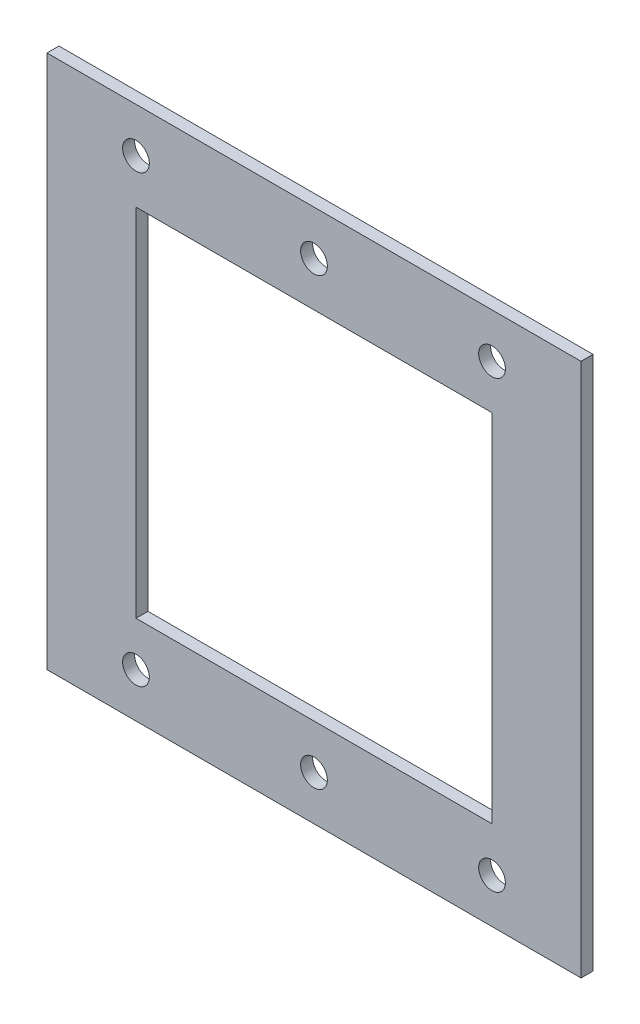
ISO-10303-21;
HEADER;
FILE_DESCRIPTION(('STEP AP214'),'2;1');
FILE_NAME('part.step','',(''),(''),'','','');
FILE_SCHEMA(('AUTOMOTIVE_DESIGN { 1 0 10303 214 1 1 1 1 }'));
ENDSEC;
DATA;
#1=APPLICATION_CONTEXT('core data for automotive mechanical design processes');
#2=APPLICATION_PROTOCOL_DEFINITION('international standard','automotive_design',2000,#1);
#3=PRODUCT_CONTEXT('',#1,'mechanical');
#4=PRODUCT('Part','Part','',(#3));
#5=PRODUCT_RELATED_PRODUCT_CATEGORY('part','',(#4));
#6=PRODUCT_DEFINITION_FORMATION('','',#4);
#7=PRODUCT_DEFINITION_CONTEXT('part definition',#1,'design');
#8=PRODUCT_DEFINITION('design','',#6,#7);
#9=PRODUCT_DEFINITION_SHAPE('','',#8);
#10=(LENGTH_UNIT() NAMED_UNIT(*) SI_UNIT(.MILLI.,.METRE.));
#11=(NAMED_UNIT(*) PLANE_ANGLE_UNIT() SI_UNIT($,.RADIAN.));
#12=(NAMED_UNIT(*) SI_UNIT($,.STERADIAN.) SOLID_ANGLE_UNIT());
#13=UNCERTAINTY_MEASURE_WITH_UNIT(LENGTH_MEASURE(1.E-05),#10,'distance_accuracy_value','');
#14=(GEOMETRIC_REPRESENTATION_CONTEXT(3) GLOBAL_UNCERTAINTY_ASSIGNED_CONTEXT((#13)) GLOBAL_UNIT_ASSIGNED_CONTEXT((#10,
#11,#12)) REPRESENTATION_CONTEXT('',''));
#15=CARTESIAN_POINT('',(0.,0.,0.));
#16=DIRECTION('',(0.,0.,1.));
#17=DIRECTION('',(1.,0.,0.));
#18=AXIS2_PLACEMENT_3D('',#15,#16,#17);
#19=CARTESIAN_POINT('',(0.,0.,2.7));
#20=DIRECTION('',(0.,0.,-1.));
#21=DIRECTION('',(-1.,0.,0.));
#22=AXIS2_PLACEMENT_3D('',#19,#20,#21);
#23=PLANE('',#22);
#24=CARTESIAN_POINT('',(40.,-50.,2.7));
#25=DIRECTION('',(0.,0.,1.));
#26=DIRECTION('',(1.,0.,0.));
#27=AXIS2_PLACEMENT_3D('',#24,#25,#26);
#28=CIRCLE('',#27,3.);
#29=CARTESIAN_POINT('',(37.,-50.,2.7));
#30=VERTEX_POINT('',#29);
#31=EDGE_CURVE('E144',#30,#30,#28,.T.);
#32=ORIENTED_EDGE('',*,*,#31,.F.);
#33=EDGE_LOOP('',(#32));
#34=FACE_BOUND('',#33,.T.);
#35=CARTESIAN_POINT('',(0.,-50.,2.7));
#36=DIRECTION('',(0.,0.,1.));
#37=DIRECTION('',(1.,0.,0.));
#38=AXIS2_PLACEMENT_3D('',#35,#36,#37);
#39=CIRCLE('',#38,3.00000000000001);
#40=CARTESIAN_POINT('',(-3.00000000000001,-50.,2.7));
#41=VERTEX_POINT('',#40);
#42=EDGE_CURVE('E150',#41,#41,#39,.T.);
#43=ORIENTED_EDGE('',*,*,#42,.F.);
#44=EDGE_LOOP('',(#43));
#45=FACE_BOUND('',#44,.T.);
#46=CARTESIAN_POINT('',(-40.,-49.9999999999997,2.7));
#47=DIRECTION('',(0.,0.,1.));
#48=DIRECTION('',(1.,0.,0.));
#49=AXIS2_PLACEMENT_3D('',#46,#47,#48);
#50=CIRCLE('',#49,3.);
#51=CARTESIAN_POINT('',(-43.,-49.9999999999997,2.7));
#52=VERTEX_POINT('',#51);
#53=EDGE_CURVE('E156',#52,#52,#50,.T.);
#54=ORIENTED_EDGE('',*,*,#53,.F.);
#55=EDGE_LOOP('',(#54));
#56=FACE_BOUND('',#55,.T.);
#57=CARTESIAN_POINT('',(40.,50.,2.7));
#58=DIRECTION('',(0.,0.,1.));
#59=DIRECTION('',(1.,0.,0.));
#60=AXIS2_PLACEMENT_3D('',#57,#58,#59);
#61=CIRCLE('',#60,3.);
#62=CARTESIAN_POINT('',(37.,50.,2.7));
#63=VERTEX_POINT('',#62);
#64=EDGE_CURVE('E162',#63,#63,#61,.T.);
#65=ORIENTED_EDGE('',*,*,#64,.F.);
#66=EDGE_LOOP('',(#65));
#67=FACE_BOUND('',#66,.T.);
#68=CARTESIAN_POINT('',(0.,50.,2.7));
#69=DIRECTION('',(0.,0.,1.));
#70=DIRECTION('',(1.,0.,0.));
#71=AXIS2_PLACEMENT_3D('',#68,#69,#70);
#72=CIRCLE('',#71,3.);
#73=CARTESIAN_POINT('',(-3.,50.,2.7));
#74=VERTEX_POINT('',#73);
#75=EDGE_CURVE('E168',#74,#74,#72,.T.);
#76=ORIENTED_EDGE('',*,*,#75,.F.);
#77=EDGE_LOOP('',(#76));
#78=FACE_BOUND('',#77,.T.);
#79=CARTESIAN_POINT('',(-40.,49.9999999999997,2.7));
#80=DIRECTION('',(0.,0.,1.));
#81=DIRECTION('',(1.,0.,0.));
#82=AXIS2_PLACEMENT_3D('',#79,#80,#81);
#83=CIRCLE('',#82,3.);
#84=CARTESIAN_POINT('',(-43.,49.9999999999997,2.7));
#85=VERTEX_POINT('',#84);
#86=EDGE_CURVE('E174',#85,#85,#83,.T.);
#87=ORIENTED_EDGE('',*,*,#86,.F.);
#88=EDGE_LOOP('',(#87));
#89=FACE_BOUND('',#88,.T.);
#90=DIRECTION('',(0.,1.,0.));
#91=VECTOR('',#90,1.);
#92=CARTESIAN_POINT('',(60.,-60.,2.7));
#93=LINE('',#92,#91);
#94=CARTESIAN_POINT('',(60.,-60.,2.7));
#95=VERTEX_POINT('',#94);
#96=CARTESIAN_POINT('',(60.,60.,2.7));
#97=VERTEX_POINT('',#96);
#98=EDGE_CURVE('E180',#95,#97,#93,.T.);
#99=ORIENTED_EDGE('',*,*,#98,.T.);
#100=DIRECTION('',(-1.,0.,0.));
#101=VECTOR('',#100,1.);
#102=CARTESIAN_POINT('',(-60.,60.,2.7));
#103=LINE('',#102,#101);
#104=CARTESIAN_POINT('',(-60.,60.,2.7));
#105=VERTEX_POINT('',#104);
#106=EDGE_CURVE('E183',#97,#105,#103,.T.);
#107=ORIENTED_EDGE('',*,*,#106,.T.);
#108=DIRECTION('',(0.,-1.,0.));
#109=VECTOR('',#108,1.);
#110=CARTESIAN_POINT('',(-60.,-60.,2.7));
#111=LINE('',#110,#109);
#112=CARTESIAN_POINT('',(-60.,-60.,2.7));
#113=VERTEX_POINT('',#112);
#114=EDGE_CURVE('E186',#105,#113,#111,.T.);
#115=ORIENTED_EDGE('',*,*,#114,.T.);
#116=DIRECTION('',(1.,0.,0.));
#117=VECTOR('',#116,1.);
#118=CARTESIAN_POINT('',(-60.,-60.,2.7));
#119=LINE('',#118,#117);
#120=EDGE_CURVE('E188',#113,#95,#119,.T.);
#121=ORIENTED_EDGE('',*,*,#120,.T.);
#122=EDGE_LOOP('',(#99,#107,#115,#121));
#123=FACE_BOUND('',#122,.T.);
#124=DIRECTION('',(0.,1.,0.));
#125=VECTOR('',#124,1.);
#126=CARTESIAN_POINT('',(40.,-40.,2.7));
#127=LINE('',#126,#125);
#128=CARTESIAN_POINT('',(40.,-40.,2.7));
#129=VERTEX_POINT('',#128);
#130=CARTESIAN_POINT('',(40.,40.,2.7));
#131=VERTEX_POINT('',#130);
#132=EDGE_CURVE('E108',#129,#131,#127,.T.);
#133=ORIENTED_EDGE('',*,*,#132,.F.);
#134=DIRECTION('',(1.,0.,0.));
#135=VECTOR('',#134,1.);
#136=CARTESIAN_POINT('',(-40.,-40.,2.7));
#137=LINE('',#136,#135);
#138=CARTESIAN_POINT('',(-40.,-40.,2.7));
#139=VERTEX_POINT('',#138);
#140=EDGE_CURVE('E130',#139,#129,#137,.T.);
#141=ORIENTED_EDGE('',*,*,#140,.F.);
#142=DIRECTION('',(0.,-1.,0.));
#143=VECTOR('',#142,1.);
#144=CARTESIAN_POINT('',(-40.,-40.,2.7));
#145=LINE('',#144,#143);
#146=CARTESIAN_POINT('',(-40.,40.,2.7));
#147=VERTEX_POINT('',#146);
#148=EDGE_CURVE('E128',#147,#139,#145,.T.);
#149=ORIENTED_EDGE('',*,*,#148,.F.);
#150=DIRECTION('',(-1.,0.,0.));
#151=VECTOR('',#150,1.);
#152=CARTESIAN_POINT('',(-40.,40.,2.7));
#153=LINE('',#152,#151);
#154=EDGE_CURVE('E116',#131,#147,#153,.T.);
#155=ORIENTED_EDGE('',*,*,#154,.F.);
#156=EDGE_LOOP('',(#133,#141,#149,#155));
#157=FACE_BOUND('',#156,.T.);
#158=ADVANCED_FACE('F43',(#34,#45,#56,#67,#78,#89,#123,#157),#23,.F.);
#159=CARTESIAN_POINT('',(0.,0.,0.));
#160=DIRECTION('',(0.,0.,-1.));
#161=DIRECTION('',(-1.,0.,0.));
#162=AXIS2_PLACEMENT_3D('',#159,#160,#161);
#163=PLANE('',#162);
#164=CARTESIAN_POINT('',(0.,-50.,0.));
#165=DIRECTION('',(0.,0.,1.));
#166=DIRECTION('',(1.,0.,0.));
#167=AXIS2_PLACEMENT_3D('',#164,#165,#166);
#168=CIRCLE('',#167,3.00000000000001);
#169=CARTESIAN_POINT('',(-3.00000000000001,-50.,0.));
#170=VERTEX_POINT('',#169);
#171=EDGE_CURVE('E147',#170,#170,#168,.T.);
#172=ORIENTED_EDGE('',*,*,#171,.T.);
#173=EDGE_LOOP('',(#172));
#174=FACE_BOUND('',#173,.T.);
#175=CARTESIAN_POINT('',(40.,50.,0.));
#176=DIRECTION('',(0.,0.,1.));
#177=DIRECTION('',(1.,0.,0.));
#178=AXIS2_PLACEMENT_3D('',#175,#176,#177);
#179=CIRCLE('',#178,3.);
#180=CARTESIAN_POINT('',(37.,50.,0.));
#181=VERTEX_POINT('',#180);
#182=EDGE_CURVE('E159',#181,#181,#179,.T.);
#183=ORIENTED_EDGE('',*,*,#182,.T.);
#184=EDGE_LOOP('',(#183));
#185=FACE_BOUND('',#184,.T.);
#186=CARTESIAN_POINT('',(-40.,49.9999999999997,0.));
#187=DIRECTION('',(0.,0.,1.));
#188=DIRECTION('',(1.,0.,0.));
#189=AXIS2_PLACEMENT_3D('',#186,#187,#188);
#190=CIRCLE('',#189,3.);
#191=CARTESIAN_POINT('',(-43.,49.9999999999997,0.));
#192=VERTEX_POINT('',#191);
#193=EDGE_CURVE('E171',#192,#192,#190,.T.);
#194=ORIENTED_EDGE('',*,*,#193,.T.);
#195=EDGE_LOOP('',(#194));
#196=FACE_BOUND('',#195,.T.);
#197=DIRECTION('',(0.,1.,0.));
#198=VECTOR('',#197,1.);
#199=CARTESIAN_POINT('',(60.,-60.,0.));
#200=LINE('',#199,#198);
#201=CARTESIAN_POINT('',(60.,-60.,0.));
#202=VERTEX_POINT('',#201);
#203=CARTESIAN_POINT('',(60.,60.,0.));
#204=VERTEX_POINT('',#203);
#205=EDGE_CURVE('E177',#202,#204,#200,.T.);
#206=ORIENTED_EDGE('',*,*,#205,.F.);
#207=DIRECTION('',(1.,0.,0.));
#208=VECTOR('',#207,1.);
#209=CARTESIAN_POINT('',(-60.,-60.,0.));
#210=LINE('',#209,#208);
#211=CARTESIAN_POINT('',(-60.,-60.,0.));
#212=VERTEX_POINT('',#211);
#213=EDGE_CURVE('E184',#212,#202,#210,.T.);
#214=ORIENTED_EDGE('',*,*,#213,.F.);
#215=DIRECTION('',(0.,-1.,0.));
#216=VECTOR('',#215,1.);
#217=CARTESIAN_POINT('',(-60.,-60.,0.));
#218=LINE('',#217,#216);
#219=CARTESIAN_POINT('',(-60.,60.,0.));
#220=VERTEX_POINT('',#219);
#221=EDGE_CURVE('E195',#220,#212,#218,.T.);
#222=ORIENTED_EDGE('',*,*,#221,.F.);
#223=DIRECTION('',(-1.,0.,0.));
#224=VECTOR('',#223,1.);
#225=CARTESIAN_POINT('',(-60.,60.,0.));
#226=LINE('',#225,#224);
#227=EDGE_CURVE('E193',#204,#220,#226,.T.);
#228=ORIENTED_EDGE('',*,*,#227,.F.);
#229=EDGE_LOOP('',(#206,#214,#222,#228));
#230=FACE_BOUND('',#229,.T.);
#231=CARTESIAN_POINT('',(0.,50.,0.));
#232=DIRECTION('',(0.,0.,1.));
#233=DIRECTION('',(1.,0.,0.));
#234=AXIS2_PLACEMENT_3D('',#231,#232,#233);
#235=CIRCLE('',#234,3.);
#236=CARTESIAN_POINT('',(-3.,50.,0.));
#237=VERTEX_POINT('',#236);
#238=EDGE_CURVE('E165',#237,#237,#235,.T.);
#239=ORIENTED_EDGE('',*,*,#238,.T.);
#240=EDGE_LOOP('',(#239));
#241=FACE_BOUND('',#240,.T.);
#242=CARTESIAN_POINT('',(-40.,-49.9999999999997,0.));
#243=DIRECTION('',(0.,0.,1.));
#244=DIRECTION('',(1.,0.,0.));
#245=AXIS2_PLACEMENT_3D('',#242,#243,#244);
#246=CIRCLE('',#245,3.);
#247=CARTESIAN_POINT('',(-43.,-49.9999999999997,0.));
#248=VERTEX_POINT('',#247);
#249=EDGE_CURVE('E153',#248,#248,#246,.T.);
#250=ORIENTED_EDGE('',*,*,#249,.T.);
#251=EDGE_LOOP('',(#250));
#252=FACE_BOUND('',#251,.T.);
#253=CARTESIAN_POINT('',(40.,-50.,0.));
#254=DIRECTION('',(0.,0.,1.));
#255=DIRECTION('',(1.,0.,0.));
#256=AXIS2_PLACEMENT_3D('',#253,#254,#255);
#257=CIRCLE('',#256,3.);
#258=CARTESIAN_POINT('',(37.,-50.,0.));
#259=VERTEX_POINT('',#258);
#260=EDGE_CURVE('E124',#259,#259,#257,.T.);
#261=ORIENTED_EDGE('',*,*,#260,.T.);
#262=EDGE_LOOP('',(#261));
#263=FACE_BOUND('',#262,.T.);
#264=DIRECTION('',(1.,0.,0.));
#265=VECTOR('',#264,1.);
#266=CARTESIAN_POINT('',(-40.,-40.,0.));
#267=LINE('',#266,#265);
#268=CARTESIAN_POINT('',(-40.,-40.,0.));
#269=VERTEX_POINT('',#268);
#270=CARTESIAN_POINT('',(40.,-40.,0.));
#271=VERTEX_POINT('',#270);
#272=EDGE_CURVE('E117',#269,#271,#267,.T.);
#273=ORIENTED_EDGE('',*,*,#272,.T.);
#274=DIRECTION('',(0.,1.,0.));
#275=VECTOR('',#274,1.);
#276=CARTESIAN_POINT('',(40.,-40.,0.));
#277=LINE('',#276,#275);
#278=CARTESIAN_POINT('',(40.,40.,0.));
#279=VERTEX_POINT('',#278);
#280=EDGE_CURVE('E66',#271,#279,#277,.T.);
#281=ORIENTED_EDGE('',*,*,#280,.T.);
#282=DIRECTION('',(-1.,0.,0.));
#283=VECTOR('',#282,1.);
#284=CARTESIAN_POINT('',(-40.,40.,0.));
#285=LINE('',#284,#283);
#286=CARTESIAN_POINT('',(-40.,40.,0.));
#287=VERTEX_POINT('',#286);
#288=EDGE_CURVE('E123',#279,#287,#285,.T.);
#289=ORIENTED_EDGE('',*,*,#288,.T.);
#290=DIRECTION('',(0.,-1.,0.));
#291=VECTOR('',#290,1.);
#292=CARTESIAN_POINT('',(-40.,-40.,0.));
#293=LINE('',#292,#291);
#294=EDGE_CURVE('E136',#287,#269,#293,.T.);
#295=ORIENTED_EDGE('',*,*,#294,.T.);
#296=EDGE_LOOP('',(#273,#281,#289,#295));
#297=FACE_BOUND('',#296,.T.);
#298=ADVANCED_FACE('F213',(#174,#185,#196,#230,#241,#252,#263,#297),#163,.T.);
#299=CARTESIAN_POINT('',(60.,-60.,2.7));
#300=DIRECTION('',(-1.,0.,0.));
#301=DIRECTION('',(0.,0.,1.));
#302=AXIS2_PLACEMENT_3D('',#299,#300,#301);
#303=PLANE('',#302);
#304=ORIENTED_EDGE('',*,*,#205,.T.);
#305=DIRECTION('',(0.,0.,-1.));
#306=VECTOR('',#305,1.);
#307=CARTESIAN_POINT('',(60.,60.,2.7));
#308=LINE('',#307,#306);
#309=EDGE_CURVE('E13',#97,#204,#308,.T.);
#310=ORIENTED_EDGE('',*,*,#309,.F.);
#311=ORIENTED_EDGE('',*,*,#98,.F.);
#312=DIRECTION('',(0.,0.,-1.));
#313=VECTOR('',#312,1.);
#314=CARTESIAN_POINT('',(60.,-60.,2.7));
#315=LINE('',#314,#313);
#316=EDGE_CURVE('E190',#95,#202,#315,.T.);
#317=ORIENTED_EDGE('',*,*,#316,.T.);
#318=EDGE_LOOP('',(#304,#310,#311,#317));
#319=FACE_BOUND('',#318,.T.);
#320=ADVANCED_FACE('F45',(#319),#303,.F.);
#321=CARTESIAN_POINT('',(-60.,60.,2.7));
#322=DIRECTION('',(0.,-1.,0.));
#323=DIRECTION('',(0.,0.,-1.));
#324=AXIS2_PLACEMENT_3D('',#321,#322,#323);
#325=PLANE('',#324);
#326=ORIENTED_EDGE('',*,*,#227,.T.);
#327=DIRECTION('',(0.,0.,-1.));
#328=VECTOR('',#327,1.);
#329=CARTESIAN_POINT('',(-60.,60.,2.7));
#330=LINE('',#329,#328);
#331=EDGE_CURVE('E51',#105,#220,#330,.T.);
#332=ORIENTED_EDGE('',*,*,#331,.F.);
#333=ORIENTED_EDGE('',*,*,#106,.F.);
#334=ORIENTED_EDGE('',*,*,#309,.T.);
#335=EDGE_LOOP('',(#326,#332,#333,#334));
#336=FACE_BOUND('',#335,.T.);
#337=ADVANCED_FACE('F223',(#336),#325,.F.);
#338=CARTESIAN_POINT('',(-60.,-60.,2.7));
#339=DIRECTION('',(1.,0.,0.));
#340=DIRECTION('',(0.,0.,-1.));
#341=AXIS2_PLACEMENT_3D('',#338,#339,#340);
#342=PLANE('',#341);
#343=ORIENTED_EDGE('',*,*,#221,.T.);
#344=DIRECTION('',(0.,0.,-1.));
#345=VECTOR('',#344,1.);
#346=CARTESIAN_POINT('',(-60.,-60.,2.7));
#347=LINE('',#346,#345);
#348=EDGE_CURVE('E200',#113,#212,#347,.T.);
#349=ORIENTED_EDGE('',*,*,#348,.F.);
#350=ORIENTED_EDGE('',*,*,#114,.F.);
#351=ORIENTED_EDGE('',*,*,#331,.T.);
#352=EDGE_LOOP('',(#343,#349,#350,#351));
#353=FACE_BOUND('',#352,.T.);
#354=ADVANCED_FACE('F207',(#353),#342,.F.);
#355=CARTESIAN_POINT('',(-60.,-60.,2.7));
#356=DIRECTION('',(0.,1.,0.));
#357=DIRECTION('',(0.,0.,1.));
#358=AXIS2_PLACEMENT_3D('',#355,#356,#357);
#359=PLANE('',#358);
#360=ORIENTED_EDGE('',*,*,#213,.T.);
#361=ORIENTED_EDGE('',*,*,#316,.F.);
#362=ORIENTED_EDGE('',*,*,#120,.F.);
#363=ORIENTED_EDGE('',*,*,#348,.T.);
#364=EDGE_LOOP('',(#360,#361,#362,#363));
#365=FACE_BOUND('',#364,.T.);
#366=ADVANCED_FACE('F217',(#365),#359,.F.);
#367=CARTESIAN_POINT('',(-40.,49.9999999999997,2.7));
#368=DIRECTION('',(0.,0.,-1.));
#369=DIRECTION('',(-1.,0.,0.));
#370=AXIS2_PLACEMENT_3D('',#367,#368,#369);
#371=CYLINDRICAL_SURFACE('',#370,3.);
#372=CARTESIAN_POINT('',(-43.,49.9999999999997,2.7));
#373=CARTESIAN_POINT('',(-43.,49.9999999999997,2.671875));
#374=CARTESIAN_POINT('',(-43.,49.9999999999997,2.64375));
#375=CARTESIAN_POINT('',(-43.,49.9999999999997,2.5875));
#376=CARTESIAN_POINT('',(-43.,49.9999999999997,2.559375));
#377=CARTESIAN_POINT('',(-43.,49.9999999999997,2.503125));
#378=CARTESIAN_POINT('',(-43.,49.9999999999997,2.475));
#379=CARTESIAN_POINT('',(-43.,49.9999999999997,2.41875));
#380=CARTESIAN_POINT('',(-43.,49.9999999999997,2.390625));
#381=CARTESIAN_POINT('',(-43.,49.9999999999997,2.334375));
#382=CARTESIAN_POINT('',(-43.,49.9999999999997,2.30625));
#383=CARTESIAN_POINT('',(-43.,49.9999999999997,2.25));
#384=CARTESIAN_POINT('',(-43.,49.9999999999997,2.221875));
#385=CARTESIAN_POINT('',(-43.,49.9999999999997,2.165625));
#386=CARTESIAN_POINT('',(-43.,49.9999999999997,2.1375));
#387=CARTESIAN_POINT('',(-43.,49.9999999999997,2.08125));
#388=CARTESIAN_POINT('',(-43.,49.9999999999997,2.053125));
#389=CARTESIAN_POINT('',(-43.,49.9999999999997,1.996875));
#390=CARTESIAN_POINT('',(-43.,49.9999999999997,1.96875));
#391=CARTESIAN_POINT('',(-43.,49.9999999999997,1.9125));
#392=CARTESIAN_POINT('',(-43.,49.9999999999997,1.884375));
#393=CARTESIAN_POINT('',(-43.,49.9999999999997,1.828125));
#394=CARTESIAN_POINT('',(-43.,49.9999999999997,1.8));
#395=CARTESIAN_POINT('',(-43.,49.9999999999997,1.74375));
#396=CARTESIAN_POINT('',(-43.,49.9999999999997,1.715625));
#397=CARTESIAN_POINT('',(-43.,49.9999999999997,1.659375));
#398=CARTESIAN_POINT('',(-43.,49.9999999999997,1.63125));
#399=CARTESIAN_POINT('',(-43.,49.9999999999997,1.575));
#400=CARTESIAN_POINT('',(-43.,49.9999999999997,1.546875));
#401=CARTESIAN_POINT('',(-43.,49.9999999999997,1.490625));
#402=CARTESIAN_POINT('',(-43.,49.9999999999997,1.4625));
#403=CARTESIAN_POINT('',(-43.,49.9999999999997,1.40625));
#404=CARTESIAN_POINT('',(-43.,49.9999999999997,1.378125));
#405=CARTESIAN_POINT('',(-43.,49.9999999999997,1.321875));
#406=CARTESIAN_POINT('',(-43.,49.9999999999997,1.29375));
#407=CARTESIAN_POINT('',(-43.,49.9999999999997,1.2375));
#408=CARTESIAN_POINT('',(-43.,49.9999999999997,1.209375));
#409=CARTESIAN_POINT('',(-43.,49.9999999999997,1.153125));
#410=CARTESIAN_POINT('',(-43.,49.9999999999997,1.125));
#411=CARTESIAN_POINT('',(-43.,49.9999999999997,1.06875));
#412=CARTESIAN_POINT('',(-43.,49.9999999999997,1.040625));
#413=CARTESIAN_POINT('',(-43.,49.9999999999997,0.984375));
#414=CARTESIAN_POINT('',(-43.,49.9999999999997,0.95625));
#415=CARTESIAN_POINT('',(-43.,49.9999999999997,0.9));
#416=CARTESIAN_POINT('',(-43.,49.9999999999997,0.871875));
#417=CARTESIAN_POINT('',(-43.,49.9999999999997,0.815625));
#418=CARTESIAN_POINT('',(-43.,49.9999999999997,0.7875));
#419=CARTESIAN_POINT('',(-43.,49.9999999999997,0.73125));
#420=CARTESIAN_POINT('',(-43.,49.9999999999997,0.703125));
#421=CARTESIAN_POINT('',(-43.,49.9999999999997,0.646875));
#422=CARTESIAN_POINT('',(-43.,49.9999999999997,0.61875));
#423=CARTESIAN_POINT('',(-43.,49.9999999999997,0.5625));
#424=CARTESIAN_POINT('',(-43.,49.9999999999997,0.534375));
#425=CARTESIAN_POINT('',(-43.,49.9999999999997,0.478125));
#426=CARTESIAN_POINT('',(-43.,49.9999999999997,0.45));
#427=CARTESIAN_POINT('',(-43.,49.9999999999997,0.39375));
#428=CARTESIAN_POINT('',(-43.,49.9999999999997,0.365625));
#429=CARTESIAN_POINT('',(-43.,49.9999999999997,0.309375));
#430=CARTESIAN_POINT('',(-43.,49.9999999999997,0.28125));
#431=CARTESIAN_POINT('',(-43.,49.9999999999997,0.225));
#432=CARTESIAN_POINT('',(-43.,49.9999999999997,0.196875));
#433=CARTESIAN_POINT('',(-43.,49.9999999999997,0.140625));
#434=CARTESIAN_POINT('',(-43.,49.9999999999997,0.112499999999999));
#435=CARTESIAN_POINT('',(-43.,49.9999999999997,0.0562499999999994));
#436=CARTESIAN_POINT('',(-43.,49.9999999999997,0.0281249999999995));
#437=CARTESIAN_POINT('',(-43.,49.9999999999997,0.));
#438=B_SPLINE_CURVE_WITH_KNOTS('',3,(#372,#373,#374,#375,#376,#377,#378,#379,#380,#381,#382,
#383,#384,#385,#386,#387,#388,#389,#390,#391,#392,#393,#394,#395,#396,#397,#398,#399,#400,#401,
#402,#403,#404,#405,#406,#407,#408,#409,#410,#411,#412,#413,#414,#415,#416,#417,#418,#419,#420,
#421,#422,#423,#424,#425,#426,#427,#428,#429,#430,#431,#432,#433,#434,#435,#436,#437),
.UNSPECIFIED.,.F.,.F.,(4,2,2,2,2,2,2,2,2,2,2,2,2,2,2,2,2,2,2,2,2,2,2,2,2,2,2,2,2,2,2,2,4),(0.,
0.0843749999999998,0.16875,0.253125,0.3375,0.421875,0.50625,0.590625,0.675,0.759375,0.84375,
0.928125,1.0125,1.096875,1.18125,1.265625,1.35,1.434375,1.51875,1.603125,1.6875,1.771875,
1.85625,1.940625,2.025,2.109375,2.19375,2.278125,2.3625,2.446875,2.53125,2.615625,2.7),.UNSPECIFIED.);
#439=EDGE_CURVE('BSEAM241',#85,#192,#438,.T.);
#440=ORIENTED_EDGE('',*,*,#86,.T.);
#441=ORIENTED_EDGE('',*,*,#193,.F.);
#442=ORIENTED_EDGE('',*,*,#439,.T.);
#443=ORIENTED_EDGE('',*,*,#439,.F.);
#444=EDGE_LOOP('',(#440,#442,#441,#443));
#445=FACE_BOUND('',#444,.T.);
#446=ADVANCED_FACE('F241',(#445),#371,.F.);
#447=CARTESIAN_POINT('',(0.,50.,2.7));
#448=DIRECTION('',(0.,0.,-1.));
#449=DIRECTION('',(-1.,0.,0.));
#450=AXIS2_PLACEMENT_3D('',#447,#448,#449);
#451=CYLINDRICAL_SURFACE('',#450,3.);
#452=CARTESIAN_POINT('',(-3.,50.,2.7));
#453=CARTESIAN_POINT('',(-3.,50.,2.671875));
#454=CARTESIAN_POINT('',(-3.,50.,2.64375));
#455=CARTESIAN_POINT('',(-3.,50.,2.5875));
#456=CARTESIAN_POINT('',(-3.,50.,2.559375));
#457=CARTESIAN_POINT('',(-3.,50.,2.503125));
#458=CARTESIAN_POINT('',(-3.,50.,2.475));
#459=CARTESIAN_POINT('',(-3.,50.,2.41875));
#460=CARTESIAN_POINT('',(-3.,50.,2.390625));
#461=CARTESIAN_POINT('',(-3.,50.,2.334375));
#462=CARTESIAN_POINT('',(-3.,50.,2.30625));
#463=CARTESIAN_POINT('',(-3.,50.,2.25));
#464=CARTESIAN_POINT('',(-3.,50.,2.221875));
#465=CARTESIAN_POINT('',(-3.,50.,2.165625));
#466=CARTESIAN_POINT('',(-3.,50.,2.1375));
#467=CARTESIAN_POINT('',(-3.,50.,2.08125));
#468=CARTESIAN_POINT('',(-3.,50.,2.053125));
#469=CARTESIAN_POINT('',(-3.,50.,1.996875));
#470=CARTESIAN_POINT('',(-3.,50.,1.96875));
#471=CARTESIAN_POINT('',(-3.,50.,1.9125));
#472=CARTESIAN_POINT('',(-3.,50.,1.884375));
#473=CARTESIAN_POINT('',(-3.,50.,1.828125));
#474=CARTESIAN_POINT('',(-3.,50.,1.8));
#475=CARTESIAN_POINT('',(-3.,50.,1.74375));
#476=CARTESIAN_POINT('',(-3.,50.,1.715625));
#477=CARTESIAN_POINT('',(-3.,50.,1.659375));
#478=CARTESIAN_POINT('',(-3.,50.,1.63125));
#479=CARTESIAN_POINT('',(-3.,50.,1.575));
#480=CARTESIAN_POINT('',(-3.,50.,1.546875));
#481=CARTESIAN_POINT('',(-3.,50.,1.490625));
#482=CARTESIAN_POINT('',(-3.,50.,1.4625));
#483=CARTESIAN_POINT('',(-3.,50.,1.40625));
#484=CARTESIAN_POINT('',(-3.,50.,1.378125));
#485=CARTESIAN_POINT('',(-3.,50.,1.321875));
#486=CARTESIAN_POINT('',(-3.,50.,1.29375));
#487=CARTESIAN_POINT('',(-3.,50.,1.2375));
#488=CARTESIAN_POINT('',(-3.,50.,1.209375));
#489=CARTESIAN_POINT('',(-3.,50.,1.153125));
#490=CARTESIAN_POINT('',(-3.,50.,1.125));
#491=CARTESIAN_POINT('',(-3.,50.,1.06875));
#492=CARTESIAN_POINT('',(-3.,50.,1.040625));
#493=CARTESIAN_POINT('',(-3.,50.,0.984375));
#494=CARTESIAN_POINT('',(-3.,50.,0.95625));
#495=CARTESIAN_POINT('',(-3.,50.,0.9));
#496=CARTESIAN_POINT('',(-3.,50.,0.871875));
#497=CARTESIAN_POINT('',(-3.,50.,0.815625));
#498=CARTESIAN_POINT('',(-3.,50.,0.7875));
#499=CARTESIAN_POINT('',(-3.,50.,0.73125));
#500=CARTESIAN_POINT('',(-3.,50.,0.703125));
#501=CARTESIAN_POINT('',(-3.,50.,0.646875));
#502=CARTESIAN_POINT('',(-3.,50.,0.61875));
#503=CARTESIAN_POINT('',(-3.,50.,0.5625));
#504=CARTESIAN_POINT('',(-3.,50.,0.534375));
#505=CARTESIAN_POINT('',(-3.,50.,0.478125));
#506=CARTESIAN_POINT('',(-3.,50.,0.45));
#507=CARTESIAN_POINT('',(-3.,50.,0.39375));
#508=CARTESIAN_POINT('',(-3.,50.,0.365625));
#509=CARTESIAN_POINT('',(-3.,50.,0.309375));
#510=CARTESIAN_POINT('',(-3.,50.,0.28125));
#511=CARTESIAN_POINT('',(-3.,50.,0.225));
#512=CARTESIAN_POINT('',(-3.,50.,0.196875));
#513=CARTESIAN_POINT('',(-3.,50.,0.140625));
#514=CARTESIAN_POINT('',(-3.,50.,0.112499999999999));
#515=CARTESIAN_POINT('',(-3.,50.,0.0562499999999994));
#516=CARTESIAN_POINT('',(-3.,50.,0.0281249999999995));
#517=CARTESIAN_POINT('',(-3.,50.,0.));
#518=B_SPLINE_CURVE_WITH_KNOTS('',3,(#452,#453,#454,#455,#456,#457,#458,#459,#460,#461,#462,
#463,#464,#465,#466,#467,#468,#469,#470,#471,#472,#473,#474,#475,#476,#477,#478,#479,#480,#481,
#482,#483,#484,#485,#486,#487,#488,#489,#490,#491,#492,#493,#494,#495,#496,#497,#498,#499,#500,
#501,#502,#503,#504,#505,#506,#507,#508,#509,#510,#511,#512,#513,#514,#515,#516,#517),
.UNSPECIFIED.,.F.,.F.,(4,2,2,2,2,2,2,2,2,2,2,2,2,2,2,2,2,2,2,2,2,2,2,2,2,2,2,2,2,2,2,2,4),(0.,
0.0843749999999998,0.16875,0.253125,0.3375,0.421875,0.50625,0.590625,0.675,0.759375,0.84375,
0.928125,1.0125,1.096875,1.18125,1.265625,1.35,1.434375,1.51875,1.603125,1.6875,1.771875,
1.85625,1.940625,2.025,2.109375,2.19375,2.278125,2.3625,2.446875,2.53125,2.615625,2.7),.UNSPECIFIED.);
#519=EDGE_CURVE('BSEAM248',#74,#237,#518,.T.);
#520=ORIENTED_EDGE('',*,*,#75,.T.);
#521=ORIENTED_EDGE('',*,*,#238,.F.);
#522=ORIENTED_EDGE('',*,*,#519,.T.);
#523=ORIENTED_EDGE('',*,*,#519,.F.);
#524=EDGE_LOOP('',(#520,#522,#521,#523));
#525=FACE_BOUND('',#524,.T.);
#526=ADVANCED_FACE('F248',(#525),#451,.F.);
#527=CARTESIAN_POINT('',(40.,50.,2.7));
#528=DIRECTION('',(0.,0.,-1.));
#529=DIRECTION('',(-1.,0.,0.));
#530=AXIS2_PLACEMENT_3D('',#527,#528,#529);
#531=CYLINDRICAL_SURFACE('',#530,3.);
#532=CARTESIAN_POINT('',(37.,50.,2.7));
#533=CARTESIAN_POINT('',(37.,50.,2.671875));
#534=CARTESIAN_POINT('',(37.,50.,2.64375));
#535=CARTESIAN_POINT('',(37.,50.,2.5875));
#536=CARTESIAN_POINT('',(37.,50.,2.559375));
#537=CARTESIAN_POINT('',(37.,50.,2.503125));
#538=CARTESIAN_POINT('',(37.,50.,2.475));
#539=CARTESIAN_POINT('',(37.,50.,2.41875));
#540=CARTESIAN_POINT('',(37.,50.,2.390625));
#541=CARTESIAN_POINT('',(37.,50.,2.334375));
#542=CARTESIAN_POINT('',(37.,50.,2.30625));
#543=CARTESIAN_POINT('',(37.,50.,2.25));
#544=CARTESIAN_POINT('',(37.,50.,2.221875));
#545=CARTESIAN_POINT('',(37.,50.,2.165625));
#546=CARTESIAN_POINT('',(37.,50.,2.1375));
#547=CARTESIAN_POINT('',(37.,50.,2.08125));
#548=CARTESIAN_POINT('',(37.,50.,2.053125));
#549=CARTESIAN_POINT('',(37.,50.,1.996875));
#550=CARTESIAN_POINT('',(37.,50.,1.96875));
#551=CARTESIAN_POINT('',(37.,50.,1.9125));
#552=CARTESIAN_POINT('',(37.,50.,1.884375));
#553=CARTESIAN_POINT('',(37.,50.,1.828125));
#554=CARTESIAN_POINT('',(37.,50.,1.8));
#555=CARTESIAN_POINT('',(37.,50.,1.74375));
#556=CARTESIAN_POINT('',(37.,50.,1.715625));
#557=CARTESIAN_POINT('',(37.,50.,1.659375));
#558=CARTESIAN_POINT('',(37.,50.,1.63125));
#559=CARTESIAN_POINT('',(37.,50.,1.575));
#560=CARTESIAN_POINT('',(37.,50.,1.546875));
#561=CARTESIAN_POINT('',(37.,50.,1.490625));
#562=CARTESIAN_POINT('',(37.,50.,1.4625));
#563=CARTESIAN_POINT('',(37.,50.,1.40625));
#564=CARTESIAN_POINT('',(37.,50.,1.378125));
#565=CARTESIAN_POINT('',(37.,50.,1.321875));
#566=CARTESIAN_POINT('',(37.,50.,1.29375));
#567=CARTESIAN_POINT('',(37.,50.,1.2375));
#568=CARTESIAN_POINT('',(37.,50.,1.209375));
#569=CARTESIAN_POINT('',(37.,50.,1.153125));
#570=CARTESIAN_POINT('',(37.,50.,1.125));
#571=CARTESIAN_POINT('',(37.,50.,1.06875));
#572=CARTESIAN_POINT('',(37.,50.,1.040625));
#573=CARTESIAN_POINT('',(37.,50.,0.984375));
#574=CARTESIAN_POINT('',(37.,50.,0.95625));
#575=CARTESIAN_POINT('',(37.,50.,0.9));
#576=CARTESIAN_POINT('',(37.,50.,0.871875));
#577=CARTESIAN_POINT('',(37.,50.,0.815625));
#578=CARTESIAN_POINT('',(37.,50.,0.7875));
#579=CARTESIAN_POINT('',(37.,50.,0.73125));
#580=CARTESIAN_POINT('',(37.,50.,0.703125));
#581=CARTESIAN_POINT('',(37.,50.,0.646875));
#582=CARTESIAN_POINT('',(37.,50.,0.61875));
#583=CARTESIAN_POINT('',(37.,50.,0.5625));
#584=CARTESIAN_POINT('',(37.,50.,0.534375));
#585=CARTESIAN_POINT('',(37.,50.,0.478125));
#586=CARTESIAN_POINT('',(37.,50.,0.45));
#587=CARTESIAN_POINT('',(37.,50.,0.39375));
#588=CARTESIAN_POINT('',(37.,50.,0.365625));
#589=CARTESIAN_POINT('',(37.,50.,0.309375));
#590=CARTESIAN_POINT('',(37.,50.,0.28125));
#591=CARTESIAN_POINT('',(37.,50.,0.225));
#592=CARTESIAN_POINT('',(37.,50.,0.196875));
#593=CARTESIAN_POINT('',(37.,50.,0.140625));
#594=CARTESIAN_POINT('',(37.,50.,0.112499999999999));
#595=CARTESIAN_POINT('',(37.,50.,0.0562499999999994));
#596=CARTESIAN_POINT('',(37.,50.,0.0281249999999995));
#597=CARTESIAN_POINT('',(37.,50.,0.));
#598=B_SPLINE_CURVE_WITH_KNOTS('',3,(#532,#533,#534,#535,#536,#537,#538,#539,#540,#541,#542,
#543,#544,#545,#546,#547,#548,#549,#550,#551,#552,#553,#554,#555,#556,#557,#558,#559,#560,#561,
#562,#563,#564,#565,#566,#567,#568,#569,#570,#571,#572,#573,#574,#575,#576,#577,#578,#579,#580,
#581,#582,#583,#584,#585,#586,#587,#588,#589,#590,#591,#592,#593,#594,#595,#596,#597),
.UNSPECIFIED.,.F.,.F.,(4,2,2,2,2,2,2,2,2,2,2,2,2,2,2,2,2,2,2,2,2,2,2,2,2,2,2,2,2,2,2,2,4),(0.,
0.0843749999999998,0.16875,0.253125,0.3375,0.421875,0.50625,0.590625,0.675,0.759375,0.84375,
0.928125,1.0125,1.096875,1.18125,1.265625,1.35,1.434375,1.51875,1.603125,1.6875,1.771875,
1.85625,1.940625,2.025,2.109375,2.19375,2.278125,2.3625,2.446875,2.53125,2.615625,2.7),.UNSPECIFIED.);
#599=EDGE_CURVE('BSEAM253',#63,#181,#598,.T.);
#600=ORIENTED_EDGE('',*,*,#64,.T.);
#601=ORIENTED_EDGE('',*,*,#182,.F.);
#602=ORIENTED_EDGE('',*,*,#599,.T.);
#603=ORIENTED_EDGE('',*,*,#599,.F.);
#604=EDGE_LOOP('',(#600,#602,#601,#603));
#605=FACE_BOUND('',#604,.T.);
#606=ADVANCED_FACE('F253',(#605),#531,.F.);
#607=CARTESIAN_POINT('',(-40.,-49.9999999999997,2.7));
#608=DIRECTION('',(0.,0.,-1.));
#609=DIRECTION('',(-1.,0.,0.));
#610=AXIS2_PLACEMENT_3D('',#607,#608,#609);
#611=CYLINDRICAL_SURFACE('',#610,3.);
#612=CARTESIAN_POINT('',(-43.,-49.9999999999997,2.7));
#613=CARTESIAN_POINT('',(-43.,-49.9999999999997,2.671875));
#614=CARTESIAN_POINT('',(-43.,-49.9999999999997,2.64375));
#615=CARTESIAN_POINT('',(-43.,-49.9999999999997,2.5875));
#616=CARTESIAN_POINT('',(-43.,-49.9999999999997,2.559375));
#617=CARTESIAN_POINT('',(-43.,-49.9999999999997,2.503125));
#618=CARTESIAN_POINT('',(-43.,-49.9999999999997,2.475));
#619=CARTESIAN_POINT('',(-43.,-49.9999999999997,2.41875));
#620=CARTESIAN_POINT('',(-43.,-49.9999999999997,2.390625));
#621=CARTESIAN_POINT('',(-43.,-49.9999999999997,2.334375));
#622=CARTESIAN_POINT('',(-43.,-49.9999999999997,2.30625));
#623=CARTESIAN_POINT('',(-43.,-49.9999999999997,2.25));
#624=CARTESIAN_POINT('',(-43.,-49.9999999999997,2.221875));
#625=CARTESIAN_POINT('',(-43.,-49.9999999999997,2.165625));
#626=CARTESIAN_POINT('',(-43.,-49.9999999999997,2.1375));
#627=CARTESIAN_POINT('',(-43.,-49.9999999999997,2.08125));
#628=CARTESIAN_POINT('',(-43.,-49.9999999999997,2.053125));
#629=CARTESIAN_POINT('',(-43.,-49.9999999999997,1.996875));
#630=CARTESIAN_POINT('',(-43.,-49.9999999999997,1.96875));
#631=CARTESIAN_POINT('',(-43.,-49.9999999999997,1.9125));
#632=CARTESIAN_POINT('',(-43.,-49.9999999999997,1.884375));
#633=CARTESIAN_POINT('',(-43.,-49.9999999999997,1.828125));
#634=CARTESIAN_POINT('',(-43.,-49.9999999999997,1.8));
#635=CARTESIAN_POINT('',(-43.,-49.9999999999997,1.74375));
#636=CARTESIAN_POINT('',(-43.,-49.9999999999997,1.715625));
#637=CARTESIAN_POINT('',(-43.,-49.9999999999997,1.659375));
#638=CARTESIAN_POINT('',(-43.,-49.9999999999997,1.63125));
#639=CARTESIAN_POINT('',(-43.,-49.9999999999997,1.575));
#640=CARTESIAN_POINT('',(-43.,-49.9999999999997,1.546875));
#641=CARTESIAN_POINT('',(-43.,-49.9999999999997,1.490625));
#642=CARTESIAN_POINT('',(-43.,-49.9999999999997,1.4625));
#643=CARTESIAN_POINT('',(-43.,-49.9999999999997,1.40625));
#644=CARTESIAN_POINT('',(-43.,-49.9999999999997,1.378125));
#645=CARTESIAN_POINT('',(-43.,-49.9999999999997,1.321875));
#646=CARTESIAN_POINT('',(-43.,-49.9999999999997,1.29375));
#647=CARTESIAN_POINT('',(-43.,-49.9999999999997,1.2375));
#648=CARTESIAN_POINT('',(-43.,-49.9999999999997,1.209375));
#649=CARTESIAN_POINT('',(-43.,-49.9999999999997,1.153125));
#650=CARTESIAN_POINT('',(-43.,-49.9999999999997,1.125));
#651=CARTESIAN_POINT('',(-43.,-49.9999999999997,1.06875));
#652=CARTESIAN_POINT('',(-43.,-49.9999999999997,1.040625));
#653=CARTESIAN_POINT('',(-43.,-49.9999999999997,0.984375));
#654=CARTESIAN_POINT('',(-43.,-49.9999999999997,0.95625));
#655=CARTESIAN_POINT('',(-43.,-49.9999999999997,0.9));
#656=CARTESIAN_POINT('',(-43.,-49.9999999999997,0.871875));
#657=CARTESIAN_POINT('',(-43.,-49.9999999999997,0.815625));
#658=CARTESIAN_POINT('',(-43.,-49.9999999999997,0.7875));
#659=CARTESIAN_POINT('',(-43.,-49.9999999999997,0.73125));
#660=CARTESIAN_POINT('',(-43.,-49.9999999999997,0.703125));
#661=CARTESIAN_POINT('',(-43.,-49.9999999999997,0.646875));
#662=CARTESIAN_POINT('',(-43.,-49.9999999999997,0.61875));
#663=CARTESIAN_POINT('',(-43.,-49.9999999999997,0.5625));
#664=CARTESIAN_POINT('',(-43.,-49.9999999999997,0.534375));
#665=CARTESIAN_POINT('',(-43.,-49.9999999999997,0.478125));
#666=CARTESIAN_POINT('',(-43.,-49.9999999999997,0.45));
#667=CARTESIAN_POINT('',(-43.,-49.9999999999997,0.39375));
#668=CARTESIAN_POINT('',(-43.,-49.9999999999997,0.365625));
#669=CARTESIAN_POINT('',(-43.,-49.9999999999997,0.309375));
#670=CARTESIAN_POINT('',(-43.,-49.9999999999997,0.28125));
#671=CARTESIAN_POINT('',(-43.,-49.9999999999997,0.225));
#672=CARTESIAN_POINT('',(-43.,-49.9999999999997,0.196875));
#673=CARTESIAN_POINT('',(-43.,-49.9999999999997,0.140625));
#674=CARTESIAN_POINT('',(-43.,-49.9999999999997,0.112499999999999));
#675=CARTESIAN_POINT('',(-43.,-49.9999999999997,0.0562499999999994));
#676=CARTESIAN_POINT('',(-43.,-49.9999999999997,0.0281249999999995));
#677=CARTESIAN_POINT('',(-43.,-49.9999999999997,0.));
#678=B_SPLINE_CURVE_WITH_KNOTS('',3,(#612,#613,#614,#615,#616,#617,#618,#619,#620,#621,#622,
#623,#624,#625,#626,#627,#628,#629,#630,#631,#632,#633,#634,#635,#636,#637,#638,#639,#640,#641,
#642,#643,#644,#645,#646,#647,#648,#649,#650,#651,#652,#653,#654,#655,#656,#657,#658,#659,#660,
#661,#662,#663,#664,#665,#666,#667,#668,#669,#670,#671,#672,#673,#674,#675,#676,#677),
.UNSPECIFIED.,.F.,.F.,(4,2,2,2,2,2,2,2,2,2,2,2,2,2,2,2,2,2,2,2,2,2,2,2,2,2,2,2,2,2,2,2,4),(0.,
0.0843749999999998,0.16875,0.253125,0.3375,0.421875,0.50625,0.590625,0.675,0.759375,0.84375,
0.928125,1.0125,1.096875,1.18125,1.265625,1.35,1.434375,1.51875,1.603125,1.6875,1.771875,
1.85625,1.940625,2.025,2.109375,2.19375,2.278125,2.3625,2.446875,2.53125,2.615625,2.7),.UNSPECIFIED.);
#679=EDGE_CURVE('BSEAM263',#52,#248,#678,.T.);
#680=ORIENTED_EDGE('',*,*,#53,.T.);
#681=ORIENTED_EDGE('',*,*,#249,.F.);
#682=ORIENTED_EDGE('',*,*,#679,.T.);
#683=ORIENTED_EDGE('',*,*,#679,.F.);
#684=EDGE_LOOP('',(#680,#682,#681,#683));
#685=FACE_BOUND('',#684,.T.);
#686=ADVANCED_FACE('F263',(#685),#611,.F.);
#687=CARTESIAN_POINT('',(0.,-50.,2.7));
#688=DIRECTION('',(0.,0.,-1.));
#689=DIRECTION('',(-1.,0.,0.));
#690=AXIS2_PLACEMENT_3D('',#687,#688,#689);
#691=CYLINDRICAL_SURFACE('',#690,3.00000000000001);
#692=CARTESIAN_POINT('',(-3.00000000000001,-50.,2.7));
#693=CARTESIAN_POINT('',(-3.00000000000001,-50.,2.671875));
#694=CARTESIAN_POINT('',(-3.00000000000001,-50.,2.64375));
#695=CARTESIAN_POINT('',(-3.00000000000001,-50.,2.5875));
#696=CARTESIAN_POINT('',(-3.00000000000001,-50.,2.559375));
#697=CARTESIAN_POINT('',(-3.00000000000001,-50.,2.503125));
#698=CARTESIAN_POINT('',(-3.00000000000001,-50.,2.475));
#699=CARTESIAN_POINT('',(-3.00000000000001,-50.,2.41875));
#700=CARTESIAN_POINT('',(-3.00000000000001,-50.,2.390625));
#701=CARTESIAN_POINT('',(-3.00000000000001,-50.,2.334375));
#702=CARTESIAN_POINT('',(-3.00000000000001,-50.,2.30625));
#703=CARTESIAN_POINT('',(-3.00000000000001,-50.,2.25));
#704=CARTESIAN_POINT('',(-3.00000000000001,-50.,2.221875));
#705=CARTESIAN_POINT('',(-3.00000000000001,-50.,2.165625));
#706=CARTESIAN_POINT('',(-3.00000000000001,-50.,2.1375));
#707=CARTESIAN_POINT('',(-3.00000000000001,-50.,2.08125));
#708=CARTESIAN_POINT('',(-3.00000000000001,-50.,2.053125));
#709=CARTESIAN_POINT('',(-3.00000000000001,-50.,1.996875));
#710=CARTESIAN_POINT('',(-3.00000000000001,-50.,1.96875));
#711=CARTESIAN_POINT('',(-3.00000000000001,-50.,1.9125));
#712=CARTESIAN_POINT('',(-3.00000000000001,-50.,1.884375));
#713=CARTESIAN_POINT('',(-3.00000000000001,-50.,1.828125));
#714=CARTESIAN_POINT('',(-3.00000000000001,-50.,1.8));
#715=CARTESIAN_POINT('',(-3.00000000000001,-50.,1.74375));
#716=CARTESIAN_POINT('',(-3.00000000000001,-50.,1.715625));
#717=CARTESIAN_POINT('',(-3.00000000000001,-50.,1.659375));
#718=CARTESIAN_POINT('',(-3.00000000000001,-50.,1.63125));
#719=CARTESIAN_POINT('',(-3.00000000000001,-50.,1.575));
#720=CARTESIAN_POINT('',(-3.00000000000001,-50.,1.546875));
#721=CARTESIAN_POINT('',(-3.00000000000001,-50.,1.490625));
#722=CARTESIAN_POINT('',(-3.00000000000001,-50.,1.4625));
#723=CARTESIAN_POINT('',(-3.00000000000001,-50.,1.40625));
#724=CARTESIAN_POINT('',(-3.00000000000001,-50.,1.378125));
#725=CARTESIAN_POINT('',(-3.00000000000001,-50.,1.321875));
#726=CARTESIAN_POINT('',(-3.00000000000001,-50.,1.29375));
#727=CARTESIAN_POINT('',(-3.00000000000001,-50.,1.2375));
#728=CARTESIAN_POINT('',(-3.00000000000001,-50.,1.209375));
#729=CARTESIAN_POINT('',(-3.00000000000001,-50.,1.153125));
#730=CARTESIAN_POINT('',(-3.00000000000001,-50.,1.125));
#731=CARTESIAN_POINT('',(-3.00000000000001,-50.,1.06875));
#732=CARTESIAN_POINT('',(-3.00000000000001,-50.,1.040625));
#733=CARTESIAN_POINT('',(-3.00000000000001,-50.,0.984375));
#734=CARTESIAN_POINT('',(-3.00000000000001,-50.,0.95625));
#735=CARTESIAN_POINT('',(-3.00000000000001,-50.,0.9));
#736=CARTESIAN_POINT('',(-3.00000000000001,-50.,0.871875));
#737=CARTESIAN_POINT('',(-3.00000000000001,-50.,0.815625));
#738=CARTESIAN_POINT('',(-3.00000000000001,-50.,0.7875));
#739=CARTESIAN_POINT('',(-3.00000000000001,-50.,0.73125));
#740=CARTESIAN_POINT('',(-3.00000000000001,-50.,0.703125));
#741=CARTESIAN_POINT('',(-3.00000000000001,-50.,0.646875));
#742=CARTESIAN_POINT('',(-3.00000000000001,-50.,0.61875));
#743=CARTESIAN_POINT('',(-3.00000000000001,-50.,0.5625));
#744=CARTESIAN_POINT('',(-3.00000000000001,-50.,0.534375));
#745=CARTESIAN_POINT('',(-3.00000000000001,-50.,0.478125));
#746=CARTESIAN_POINT('',(-3.00000000000001,-50.,0.45));
#747=CARTESIAN_POINT('',(-3.00000000000001,-50.,0.39375));
#748=CARTESIAN_POINT('',(-3.00000000000001,-50.,0.365625));
#749=CARTESIAN_POINT('',(-3.00000000000001,-50.,0.309375));
#750=CARTESIAN_POINT('',(-3.00000000000001,-50.,0.28125));
#751=CARTESIAN_POINT('',(-3.00000000000001,-50.,0.225));
#752=CARTESIAN_POINT('',(-3.00000000000001,-50.,0.196875));
#753=CARTESIAN_POINT('',(-3.00000000000001,-50.,0.140625));
#754=CARTESIAN_POINT('',(-3.00000000000001,-50.,0.112499999999999));
#755=CARTESIAN_POINT('',(-3.00000000000001,-50.,0.0562499999999994));
#756=CARTESIAN_POINT('',(-3.00000000000001,-50.,0.0281249999999995));
#757=CARTESIAN_POINT('',(-3.00000000000001,-50.,0.));
#758=B_SPLINE_CURVE_WITH_KNOTS('',3,(#692,#693,#694,#695,#696,#697,#698,#699,#700,#701,#702,
#703,#704,#705,#706,#707,#708,#709,#710,#711,#712,#713,#714,#715,#716,#717,#718,#719,#720,#721,
#722,#723,#724,#725,#726,#727,#728,#729,#730,#731,#732,#733,#734,#735,#736,#737,#738,#739,#740,
#741,#742,#743,#744,#745,#746,#747,#748,#749,#750,#751,#752,#753,#754,#755,#756,#757),
.UNSPECIFIED.,.F.,.F.,(4,2,2,2,2,2,2,2,2,2,2,2,2,2,2,2,2,2,2,2,2,2,2,2,2,2,2,2,2,2,2,2,4),(0.,
0.0843749999999998,0.16875,0.253125,0.3375,0.421875,0.50625,0.590625,0.675,0.759375,0.84375,
0.928125,1.0125,1.096875,1.18125,1.265625,1.35,1.434375,1.51875,1.603125,1.6875,1.771875,
1.85625,1.940625,2.025,2.109375,2.19375,2.278125,2.3625,2.446875,2.53125,2.615625,2.7),.UNSPECIFIED.);
#759=EDGE_CURVE('BSEAM270',#41,#170,#758,.T.);
#760=ORIENTED_EDGE('',*,*,#42,.T.);
#761=ORIENTED_EDGE('',*,*,#171,.F.);
#762=ORIENTED_EDGE('',*,*,#759,.T.);
#763=ORIENTED_EDGE('',*,*,#759,.F.);
#764=EDGE_LOOP('',(#760,#762,#761,#763));
#765=FACE_BOUND('',#764,.T.);
#766=ADVANCED_FACE('F270',(#765),#691,.F.);
#767=CARTESIAN_POINT('',(40.,-50.,2.7));
#768=DIRECTION('',(0.,0.,-1.));
#769=DIRECTION('',(-1.,0.,0.));
#770=AXIS2_PLACEMENT_3D('',#767,#768,#769);
#771=CYLINDRICAL_SURFACE('',#770,3.);
#772=CARTESIAN_POINT('',(37.,-50.,2.7));
#773=CARTESIAN_POINT('',(37.,-50.,2.671875));
#774=CARTESIAN_POINT('',(37.,-50.,2.64375));
#775=CARTESIAN_POINT('',(37.,-50.,2.5875));
#776=CARTESIAN_POINT('',(37.,-50.,2.559375));
#777=CARTESIAN_POINT('',(37.,-50.,2.503125));
#778=CARTESIAN_POINT('',(37.,-50.,2.475));
#779=CARTESIAN_POINT('',(37.,-50.,2.41875));
#780=CARTESIAN_POINT('',(37.,-50.,2.390625));
#781=CARTESIAN_POINT('',(37.,-50.,2.334375));
#782=CARTESIAN_POINT('',(37.,-50.,2.30625));
#783=CARTESIAN_POINT('',(37.,-50.,2.25));
#784=CARTESIAN_POINT('',(37.,-50.,2.221875));
#785=CARTESIAN_POINT('',(37.,-50.,2.165625));
#786=CARTESIAN_POINT('',(37.,-50.,2.1375));
#787=CARTESIAN_POINT('',(37.,-50.,2.08125));
#788=CARTESIAN_POINT('',(37.,-50.,2.053125));
#789=CARTESIAN_POINT('',(37.,-50.,1.996875));
#790=CARTESIAN_POINT('',(37.,-50.,1.96875));
#791=CARTESIAN_POINT('',(37.,-50.,1.9125));
#792=CARTESIAN_POINT('',(37.,-50.,1.884375));
#793=CARTESIAN_POINT('',(37.,-50.,1.828125));
#794=CARTESIAN_POINT('',(37.,-50.,1.8));
#795=CARTESIAN_POINT('',(37.,-50.,1.74375));
#796=CARTESIAN_POINT('',(37.,-50.,1.715625));
#797=CARTESIAN_POINT('',(37.,-50.,1.659375));
#798=CARTESIAN_POINT('',(37.,-50.,1.63125));
#799=CARTESIAN_POINT('',(37.,-50.,1.575));
#800=CARTESIAN_POINT('',(37.,-50.,1.546875));
#801=CARTESIAN_POINT('',(37.,-50.,1.490625));
#802=CARTESIAN_POINT('',(37.,-50.,1.4625));
#803=CARTESIAN_POINT('',(37.,-50.,1.40625));
#804=CARTESIAN_POINT('',(37.,-50.,1.378125));
#805=CARTESIAN_POINT('',(37.,-50.,1.321875));
#806=CARTESIAN_POINT('',(37.,-50.,1.29375));
#807=CARTESIAN_POINT('',(37.,-50.,1.2375));
#808=CARTESIAN_POINT('',(37.,-50.,1.209375));
#809=CARTESIAN_POINT('',(37.,-50.,1.153125));
#810=CARTESIAN_POINT('',(37.,-50.,1.125));
#811=CARTESIAN_POINT('',(37.,-50.,1.06875));
#812=CARTESIAN_POINT('',(37.,-50.,1.040625));
#813=CARTESIAN_POINT('',(37.,-50.,0.984375));
#814=CARTESIAN_POINT('',(37.,-50.,0.95625));
#815=CARTESIAN_POINT('',(37.,-50.,0.9));
#816=CARTESIAN_POINT('',(37.,-50.,0.871875));
#817=CARTESIAN_POINT('',(37.,-50.,0.815625));
#818=CARTESIAN_POINT('',(37.,-50.,0.7875));
#819=CARTESIAN_POINT('',(37.,-50.,0.73125));
#820=CARTESIAN_POINT('',(37.,-50.,0.703125));
#821=CARTESIAN_POINT('',(37.,-50.,0.646875));
#822=CARTESIAN_POINT('',(37.,-50.,0.61875));
#823=CARTESIAN_POINT('',(37.,-50.,0.5625));
#824=CARTESIAN_POINT('',(37.,-50.,0.534375));
#825=CARTESIAN_POINT('',(37.,-50.,0.478125));
#826=CARTESIAN_POINT('',(37.,-50.,0.45));
#827=CARTESIAN_POINT('',(37.,-50.,0.39375));
#828=CARTESIAN_POINT('',(37.,-50.,0.365625));
#829=CARTESIAN_POINT('',(37.,-50.,0.309375));
#830=CARTESIAN_POINT('',(37.,-50.,0.28125));
#831=CARTESIAN_POINT('',(37.,-50.,0.225));
#832=CARTESIAN_POINT('',(37.,-50.,0.196875));
#833=CARTESIAN_POINT('',(37.,-50.,0.140625));
#834=CARTESIAN_POINT('',(37.,-50.,0.112499999999999));
#835=CARTESIAN_POINT('',(37.,-50.,0.0562499999999994));
#836=CARTESIAN_POINT('',(37.,-50.,0.0281249999999995));
#837=CARTESIAN_POINT('',(37.,-50.,0.));
#838=B_SPLINE_CURVE_WITH_KNOTS('',3,(#772,#773,#774,#775,#776,#777,#778,#779,#780,#781,#782,
#783,#784,#785,#786,#787,#788,#789,#790,#791,#792,#793,#794,#795,#796,#797,#798,#799,#800,#801,
#802,#803,#804,#805,#806,#807,#808,#809,#810,#811,#812,#813,#814,#815,#816,#817,#818,#819,#820,
#821,#822,#823,#824,#825,#826,#827,#828,#829,#830,#831,#832,#833,#834,#835,#836,#837),
.UNSPECIFIED.,.F.,.F.,(4,2,2,2,2,2,2,2,2,2,2,2,2,2,2,2,2,2,2,2,2,2,2,2,2,2,2,2,2,2,2,2,4),(0.,
0.0843749999999998,0.16875,0.253125,0.3375,0.421875,0.50625,0.590625,0.675,0.759375,0.84375,
0.928125,1.0125,1.096875,1.18125,1.265625,1.35,1.434375,1.51875,1.603125,1.6875,1.771875,
1.85625,1.940625,2.025,2.109375,2.19375,2.278125,2.3625,2.446875,2.53125,2.615625,2.7),.UNSPECIFIED.);
#839=EDGE_CURVE('BSEAM274',#30,#259,#838,.T.);
#840=ORIENTED_EDGE('',*,*,#31,.T.);
#841=ORIENTED_EDGE('',*,*,#260,.F.);
#842=ORIENTED_EDGE('',*,*,#839,.T.);
#843=ORIENTED_EDGE('',*,*,#839,.F.);
#844=EDGE_LOOP('',(#840,#842,#841,#843));
#845=FACE_BOUND('',#844,.T.);
#846=ADVANCED_FACE('F274',(#845),#771,.F.);
#847=CARTESIAN_POINT('',(40.,-40.,2.7));
#848=DIRECTION('',(-1.,0.,0.));
#849=DIRECTION('',(0.,0.,1.));
#850=AXIS2_PLACEMENT_3D('',#847,#848,#849);
#851=PLANE('',#850);
#852=ORIENTED_EDGE('',*,*,#280,.F.);
#853=DIRECTION('',(0.,0.,-1.));
#854=VECTOR('',#853,1.);
#855=CARTESIAN_POINT('',(40.,-40.,2.7));
#856=LINE('',#855,#854);
#857=EDGE_CURVE('E112',#129,#271,#856,.T.);
#858=ORIENTED_EDGE('',*,*,#857,.F.);
#859=ORIENTED_EDGE('',*,*,#132,.T.);
#860=DIRECTION('',(0.,0.,-1.));
#861=VECTOR('',#860,1.);
#862=CARTESIAN_POINT('',(40.,40.,2.7));
#863=LINE('',#862,#861);
#864=EDGE_CURVE('E111',#131,#279,#863,.T.);
#865=ORIENTED_EDGE('',*,*,#864,.T.);
#866=EDGE_LOOP('',(#852,#858,#859,#865));
#867=FACE_BOUND('',#866,.T.);
#868=ADVANCED_FACE('F110',(#867),#851,.T.);
#869=CARTESIAN_POINT('',(-40.,40.,2.7));
#870=DIRECTION('',(0.,-1.,0.));
#871=DIRECTION('',(0.,0.,-1.));
#872=AXIS2_PLACEMENT_3D('',#869,#870,#871);
#873=PLANE('',#872);
#874=ORIENTED_EDGE('',*,*,#288,.F.);
#875=ORIENTED_EDGE('',*,*,#864,.F.);
#876=ORIENTED_EDGE('',*,*,#154,.T.);
#877=DIRECTION('',(0.,0.,-1.));
#878=VECTOR('',#877,1.);
#879=CARTESIAN_POINT('',(-40.,40.,2.7));
#880=LINE('',#879,#878);
#881=EDGE_CURVE('E125',#147,#287,#880,.T.);
#882=ORIENTED_EDGE('',*,*,#881,.T.);
#883=EDGE_LOOP('',(#874,#875,#876,#882));
#884=FACE_BOUND('',#883,.T.);
#885=ADVANCED_FACE('F120',(#884),#873,.T.);
#886=CARTESIAN_POINT('',(-40.,-40.,2.7));
#887=DIRECTION('',(1.,0.,0.));
#888=DIRECTION('',(0.,0.,-1.));
#889=AXIS2_PLACEMENT_3D('',#886,#887,#888);
#890=PLANE('',#889);
#891=ORIENTED_EDGE('',*,*,#294,.F.);
#892=ORIENTED_EDGE('',*,*,#881,.F.);
#893=ORIENTED_EDGE('',*,*,#148,.T.);
#894=DIRECTION('',(0.,0.,-1.));
#895=VECTOR('',#894,1.);
#896=CARTESIAN_POINT('',(-40.,-40.,2.7));
#897=LINE('',#896,#895);
#898=EDGE_CURVE('E58',#139,#269,#897,.T.);
#899=ORIENTED_EDGE('',*,*,#898,.T.);
#900=EDGE_LOOP('',(#891,#892,#893,#899));
#901=FACE_BOUND('',#900,.T.);
#902=ADVANCED_FACE('F283',(#901),#890,.T.);
#903=CARTESIAN_POINT('',(-40.,-40.,2.7));
#904=DIRECTION('',(0.,1.,0.));
#905=DIRECTION('',(0.,0.,1.));
#906=AXIS2_PLACEMENT_3D('',#903,#904,#905);
#907=PLANE('',#906);
#908=ORIENTED_EDGE('',*,*,#272,.F.);
#909=ORIENTED_EDGE('',*,*,#898,.F.);
#910=ORIENTED_EDGE('',*,*,#140,.T.);
#911=ORIENTED_EDGE('',*,*,#857,.T.);
#912=EDGE_LOOP('',(#908,#909,#910,#911));
#913=FACE_BOUND('',#912,.T.);
#914=ADVANCED_FACE('F286',(#913),#907,.T.);
#915=CLOSED_SHELL('',(#158,#298,#320,#337,#354,#366,#446,#526,#606,#686,#766,#846,#868,#885,
#902,#914));
#916=MANIFOLD_SOLID_BREP('B2',#915);
#917=ADVANCED_BREP_SHAPE_REPRESENTATION('',(#18,#916),#14);
#918=SHAPE_DEFINITION_REPRESENTATION(#9,#917);
ENDSEC;
END-ISO-10303-21;
